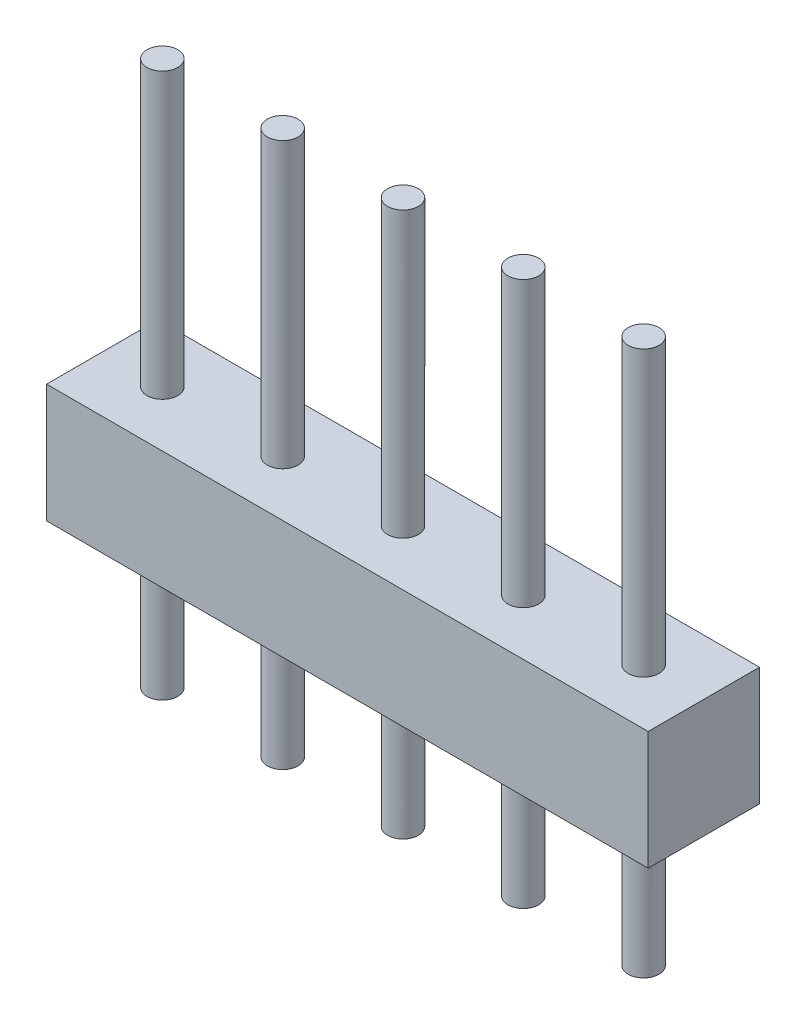
ISO-10303-21;
HEADER;
FILE_DESCRIPTION(('STEP AP214'),'2;1');
FILE_NAME('part.step','',(''),(''),'','','');
FILE_SCHEMA(('AUTOMOTIVE_DESIGN { 1 0 10303 214 1 1 1 1 }'));
ENDSEC;
DATA;
#1=APPLICATION_CONTEXT('core data for automotive mechanical design processes');
#2=APPLICATION_PROTOCOL_DEFINITION('international standard','automotive_design',2000,#1);
#3=PRODUCT_CONTEXT('',#1,'mechanical');
#4=PRODUCT('Part','Part','',(#3));
#5=PRODUCT_RELATED_PRODUCT_CATEGORY('part','',(#4));
#6=PRODUCT_DEFINITION_FORMATION('','',#4);
#7=PRODUCT_DEFINITION_CONTEXT('part definition',#1,'design');
#8=PRODUCT_DEFINITION('design','',#6,#7);
#9=PRODUCT_DEFINITION_SHAPE('','',#8);
#10=(LENGTH_UNIT() NAMED_UNIT(*) SI_UNIT(.MILLI.,.METRE.));
#11=(NAMED_UNIT(*) PLANE_ANGLE_UNIT() SI_UNIT($,.RADIAN.));
#12=(NAMED_UNIT(*) SI_UNIT($,.STERADIAN.) SOLID_ANGLE_UNIT());
#13=UNCERTAINTY_MEASURE_WITH_UNIT(LENGTH_MEASURE(1.E-05),#10,'distance_accuracy_value','');
#14=(GEOMETRIC_REPRESENTATION_CONTEXT(3) GLOBAL_UNCERTAINTY_ASSIGNED_CONTEXT((#13)) GLOBAL_UNIT_ASSIGNED_CONTEXT((#10,
#11,#12)) REPRESENTATION_CONTEXT('',''));
#15=CARTESIAN_POINT('',(0.,0.,0.));
#16=DIRECTION('',(0.,0.,1.));
#17=DIRECTION('',(1.,0.,0.));
#18=AXIS2_PLACEMENT_3D('',#15,#16,#17);
#19=CARTESIAN_POINT('',(0.,2.5,0.));
#20=DIRECTION('',(1.,0.,0.));
#21=DIRECTION('',(0.,0.,-1.));
#22=AXIS2_PLACEMENT_3D('',#19,#20,#21);
#23=PLANE('',#22);
#24=DIRECTION('',(0.,0.,1.));
#25=VECTOR('',#24,1.);
#26=CARTESIAN_POINT('',(0.,0.,0.));
#27=LINE('',#26,#25);
#28=CARTESIAN_POINT('',(0.,0.,-2.35));
#29=VERTEX_POINT('',#28);
#30=CARTESIAN_POINT('',(0.,0.,0.));
#31=VERTEX_POINT('',#30);
#32=EDGE_CURVE('E82',#29,#31,#27,.T.);
#33=ORIENTED_EDGE('',*,*,#32,.T.);
#34=DIRECTION('',(0.,-1.,0.));
#35=VECTOR('',#34,1.);
#36=CARTESIAN_POINT('',(0.,2.5,0.));
#37=LINE('',#36,#35);
#38=CARTESIAN_POINT('',(0.,2.5,0.));
#39=VERTEX_POINT('',#38);
#40=EDGE_CURVE('E119',#39,#31,#37,.T.);
#41=ORIENTED_EDGE('',*,*,#40,.F.);
#42=DIRECTION('',(0.,0.,1.));
#43=VECTOR('',#42,1.);
#44=CARTESIAN_POINT('',(0.,2.5,0.));
#45=LINE('',#44,#43);
#46=CARTESIAN_POINT('',(0.,2.5,-2.35));
#47=VERTEX_POINT('',#46);
#48=EDGE_CURVE('E84',#47,#39,#45,.T.);
#49=ORIENTED_EDGE('',*,*,#48,.F.);
#50=DIRECTION('',(0.,-1.,0.));
#51=VECTOR('',#50,1.);
#52=CARTESIAN_POINT('',(0.,2.5,-2.35));
#53=LINE('',#52,#51);
#54=EDGE_CURVE('E115',#47,#29,#53,.T.);
#55=ORIENTED_EDGE('',*,*,#54,.T.);
#56=EDGE_LOOP('',(#33,#41,#49,#55));
#57=FACE_BOUND('',#56,.T.);
#58=ADVANCED_FACE('F36',(#57),#23,.F.);
#59=CARTESIAN_POINT('',(0.,2.5,0.));
#60=DIRECTION('',(0.,0.,-1.));
#61=DIRECTION('',(-1.,0.,0.));
#62=AXIS2_PLACEMENT_3D('',#59,#60,#61);
#63=PLANE('',#62);
#64=DIRECTION('',(1.,0.,0.));
#65=VECTOR('',#64,1.);
#66=CARTESIAN_POINT('',(0.,0.,0.));
#67=LINE('',#66,#65);
#68=CARTESIAN_POINT('',(12.7,0.,0.));
#69=VERTEX_POINT('',#68);
#70=EDGE_CURVE('E64',#31,#69,#67,.T.);
#71=ORIENTED_EDGE('',*,*,#70,.T.);
#72=DIRECTION('',(0.,-1.,0.));
#73=VECTOR('',#72,1.);
#74=CARTESIAN_POINT('',(12.7,2.5,0.));
#75=LINE('',#74,#73);
#76=CARTESIAN_POINT('',(12.7,2.5,0.));
#77=VERTEX_POINT('',#76);
#78=EDGE_CURVE('E93',#77,#69,#75,.T.);
#79=ORIENTED_EDGE('',*,*,#78,.F.);
#80=DIRECTION('',(1.,0.,0.));
#81=VECTOR('',#80,1.);
#82=CARTESIAN_POINT('',(0.,2.5,0.));
#83=LINE('',#82,#81);
#84=EDGE_CURVE('E112',#39,#77,#83,.T.);
#85=ORIENTED_EDGE('',*,*,#84,.F.);
#86=ORIENTED_EDGE('',*,*,#40,.T.);
#87=EDGE_LOOP('',(#71,#79,#85,#86));
#88=FACE_BOUND('',#87,.T.);
#89=ADVANCED_FACE('F160',(#88),#63,.F.);
#90=CARTESIAN_POINT('',(0.,2.5,-2.35));
#91=DIRECTION('',(0.,0.,1.));
#92=DIRECTION('',(1.,0.,0.));
#93=AXIS2_PLACEMENT_3D('',#90,#91,#92);
#94=PLANE('',#93);
#95=DIRECTION('',(-1.,0.,0.));
#96=VECTOR('',#95,1.);
#97=CARTESIAN_POINT('',(0.,0.,-2.35));
#98=LINE('',#97,#96);
#99=CARTESIAN_POINT('',(12.7,0.,-2.35));
#100=VERTEX_POINT('',#99);
#101=EDGE_CURVE('E77',#100,#29,#98,.T.);
#102=ORIENTED_EDGE('',*,*,#101,.T.);
#103=ORIENTED_EDGE('',*,*,#54,.F.);
#104=DIRECTION('',(-1.,0.,0.));
#105=VECTOR('',#104,1.);
#106=CARTESIAN_POINT('',(0.,2.5,-2.35));
#107=LINE('',#106,#105);
#108=CARTESIAN_POINT('',(12.7,2.5,-2.35));
#109=VERTEX_POINT('',#108);
#110=EDGE_CURVE('E52',#109,#47,#107,.T.);
#111=ORIENTED_EDGE('',*,*,#110,.F.);
#112=DIRECTION('',(0.,-1.,0.));
#113=VECTOR('',#112,1.);
#114=CARTESIAN_POINT('',(12.7,2.5,-2.35));
#115=LINE('',#114,#113);
#116=EDGE_CURVE('E91',#109,#100,#115,.T.);
#117=ORIENTED_EDGE('',*,*,#116,.T.);
#118=EDGE_LOOP('',(#102,#103,#111,#117));
#119=FACE_BOUND('',#118,.T.);
#120=ADVANCED_FACE('F97',(#119),#94,.F.);
#121=CARTESIAN_POINT('',(0.,2.5,0.));
#122=DIRECTION('',(0.,-1.,0.));
#123=DIRECTION('',(0.,0.,-1.));
#124=AXIS2_PLACEMENT_3D('',#121,#122,#123);
#125=PLANE('',#124);
#126=CARTESIAN_POINT('',(11.43,2.5,-1.175));
#127=DIRECTION('',(0.,-1.,0.));
#128=DIRECTION('',(0.,0.,-1.));
#129=AXIS2_PLACEMENT_3D('',#126,#127,#128);
#130=CIRCLE('',#129,0.325);
#131=CARTESIAN_POINT('',(11.43,2.5,-1.5));
#132=VERTEX_POINT('',#131);
#133=EDGE_CURVE('E178',#132,#132,#130,.T.);
#134=ORIENTED_EDGE('',*,*,#133,.T.);
#135=EDGE_LOOP('',(#134));
#136=FACE_BOUND('',#135,.T.);
#137=CARTESIAN_POINT('',(8.89,2.5,-1.175));
#138=DIRECTION('',(0.,-1.,0.));
#139=DIRECTION('',(0.,0.,-1.));
#140=AXIS2_PLACEMENT_3D('',#137,#138,#139);
#141=CIRCLE('',#140,0.325);
#142=CARTESIAN_POINT('',(8.89,2.5,-1.5));
#143=VERTEX_POINT('',#142);
#144=EDGE_CURVE('E182',#143,#143,#141,.T.);
#145=ORIENTED_EDGE('',*,*,#144,.T.);
#146=EDGE_LOOP('',(#145));
#147=FACE_BOUND('',#146,.T.);
#148=CARTESIAN_POINT('',(6.35,2.5,-1.175));
#149=DIRECTION('',(0.,-1.,0.));
#150=DIRECTION('',(0.,0.,-1.));
#151=AXIS2_PLACEMENT_3D('',#148,#149,#150);
#152=CIRCLE('',#151,0.325);
#153=CARTESIAN_POINT('',(6.35,2.5,-1.5));
#154=VERTEX_POINT('',#153);
#155=EDGE_CURVE('E186',#154,#154,#152,.T.);
#156=ORIENTED_EDGE('',*,*,#155,.T.);
#157=EDGE_LOOP('',(#156));
#158=FACE_BOUND('',#157,.T.);
#159=CARTESIAN_POINT('',(3.81,2.5,-1.175));
#160=DIRECTION('',(0.,-1.,0.));
#161=DIRECTION('',(0.,0.,-1.));
#162=AXIS2_PLACEMENT_3D('',#159,#160,#161);
#163=CIRCLE('',#162,0.325);
#164=CARTESIAN_POINT('',(3.81,2.5,-1.5));
#165=VERTEX_POINT('',#164);
#166=EDGE_CURVE('E95',#165,#165,#163,.T.);
#167=ORIENTED_EDGE('',*,*,#166,.T.);
#168=EDGE_LOOP('',(#167));
#169=FACE_BOUND('',#168,.T.);
#170=CARTESIAN_POINT('',(1.27,2.5,-1.175));
#171=DIRECTION('',(0.,-1.,0.));
#172=DIRECTION('',(0.,0.,-1.));
#173=AXIS2_PLACEMENT_3D('',#170,#171,#172);
#174=CIRCLE('',#173,0.325);
#175=CARTESIAN_POINT('',(1.27,2.5,-1.5));
#176=VERTEX_POINT('',#175);
#177=EDGE_CURVE('E108',#176,#176,#174,.T.);
#178=ORIENTED_EDGE('',*,*,#177,.T.);
#179=EDGE_LOOP('',(#178));
#180=FACE_BOUND('',#179,.T.);
#181=ORIENTED_EDGE('',*,*,#48,.T.);
#182=ORIENTED_EDGE('',*,*,#84,.T.);
#183=DIRECTION('',(0.,0.,-1.));
#184=VECTOR('',#183,1.);
#185=CARTESIAN_POINT('',(12.7,2.5,0.));
#186=LINE('',#185,#184);
#187=EDGE_CURVE('E94',#77,#109,#186,.T.);
#188=ORIENTED_EDGE('',*,*,#187,.T.);
#189=ORIENTED_EDGE('',*,*,#110,.T.);
#190=EDGE_LOOP('',(#181,#182,#188,#189));
#191=FACE_BOUND('',#190,.T.);
#192=ADVANCED_FACE('F138',(#136,#147,#158,#169,#180,#191),#125,.F.);
#193=CARTESIAN_POINT('',(0.,0.,0.));
#194=DIRECTION('',(0.,-1.,0.));
#195=DIRECTION('',(0.,0.,-1.));
#196=AXIS2_PLACEMENT_3D('',#193,#194,#195);
#197=PLANE('',#196);
#198=CARTESIAN_POINT('',(11.43,0.,-1.175));
#199=DIRECTION('',(0.,-1.,0.));
#200=DIRECTION('',(0.,0.,-1.));
#201=AXIS2_PLACEMENT_3D('',#198,#199,#200);
#202=CIRCLE('',#201,0.325);
#203=CARTESIAN_POINT('',(11.43,0.,-1.5));
#204=VERTEX_POINT('',#203);
#205=EDGE_CURVE('E11',#204,#204,#202,.T.);
#206=ORIENTED_EDGE('',*,*,#205,.F.);
#207=EDGE_LOOP('',(#206));
#208=FACE_BOUND('',#207,.T.);
#209=CARTESIAN_POINT('',(8.89,0.,-1.175));
#210=DIRECTION('',(0.,-1.,0.));
#211=DIRECTION('',(0.,0.,-1.));
#212=AXIS2_PLACEMENT_3D('',#209,#210,#211);
#213=CIRCLE('',#212,0.325);
#214=CARTESIAN_POINT('',(8.89,0.,-1.5));
#215=VERTEX_POINT('',#214);
#216=EDGE_CURVE('E44',#215,#215,#213,.T.);
#217=ORIENTED_EDGE('',*,*,#216,.F.);
#218=EDGE_LOOP('',(#217));
#219=FACE_BOUND('',#218,.T.);
#220=CARTESIAN_POINT('',(6.35,0.,-1.175));
#221=DIRECTION('',(0.,-1.,0.));
#222=DIRECTION('',(0.,0.,-1.));
#223=AXIS2_PLACEMENT_3D('',#220,#221,#222);
#224=CIRCLE('',#223,0.325);
#225=CARTESIAN_POINT('',(6.35,0.,-1.5));
#226=VERTEX_POINT('',#225);
#227=EDGE_CURVE('E127',#226,#226,#224,.T.);
#228=ORIENTED_EDGE('',*,*,#227,.F.);
#229=EDGE_LOOP('',(#228));
#230=FACE_BOUND('',#229,.T.);
#231=CARTESIAN_POINT('',(3.81,0.,-1.175));
#232=DIRECTION('',(0.,-1.,0.));
#233=DIRECTION('',(0.,0.,-1.));
#234=AXIS2_PLACEMENT_3D('',#231,#232,#233);
#235=CIRCLE('',#234,0.325);
#236=CARTESIAN_POINT('',(3.81,0.,-1.5));
#237=VERTEX_POINT('',#236);
#238=EDGE_CURVE('E124',#237,#237,#235,.T.);
#239=ORIENTED_EDGE('',*,*,#238,.F.);
#240=EDGE_LOOP('',(#239));
#241=FACE_BOUND('',#240,.T.);
#242=CARTESIAN_POINT('',(1.27,0.,-1.175));
#243=DIRECTION('',(0.,-1.,0.));
#244=DIRECTION('',(0.,0.,-1.));
#245=AXIS2_PLACEMENT_3D('',#242,#243,#244);
#246=CIRCLE('',#245,0.325);
#247=CARTESIAN_POINT('',(1.27,0.,-1.5));
#248=VERTEX_POINT('',#247);
#249=EDGE_CURVE('E121',#248,#248,#246,.T.);
#250=ORIENTED_EDGE('',*,*,#249,.F.);
#251=EDGE_LOOP('',(#250));
#252=FACE_BOUND('',#251,.T.);
#253=ORIENTED_EDGE('',*,*,#32,.F.);
#254=ORIENTED_EDGE('',*,*,#101,.F.);
#255=DIRECTION('',(0.,0.,-1.));
#256=VECTOR('',#255,1.);
#257=CARTESIAN_POINT('',(12.7,0.,0.));
#258=LINE('',#257,#256);
#259=EDGE_CURVE('E80',#69,#100,#258,.T.);
#260=ORIENTED_EDGE('',*,*,#259,.F.);
#261=ORIENTED_EDGE('',*,*,#70,.F.);
#262=EDGE_LOOP('',(#253,#254,#260,#261));
#263=FACE_BOUND('',#262,.T.);
#264=ADVANCED_FACE('F79',(#208,#219,#230,#241,#252,#263),#197,.T.);
#265=CARTESIAN_POINT('',(1.27,-3.,-1.175));
#266=DIRECTION('',(0.,1.,0.));
#267=DIRECTION('',(0.,0.,1.));
#268=AXIS2_PLACEMENT_3D('',#265,#266,#267);
#269=PLANE('',#268);
#270=CARTESIAN_POINT('',(1.27,-3.,-1.175));
#271=DIRECTION('',(0.,1.,0.));
#272=DIRECTION('',(0.,0.,1.));
#273=AXIS2_PLACEMENT_3D('',#270,#271,#272);
#274=CIRCLE('',#273,0.325);
#275=CARTESIAN_POINT('',(1.27,-3.,-0.85));
#276=VERTEX_POINT('',#275);
#277=EDGE_CURVE('E105',#276,#276,#274,.T.);
#278=ORIENTED_EDGE('',*,*,#277,.F.);
#279=EDGE_LOOP('',(#278));
#280=FACE_BOUND('',#279,.T.);
#281=ADVANCED_FACE('F137',(#280),#269,.F.);
#282=CARTESIAN_POINT('',(1.27,-3.,-1.175));
#283=DIRECTION('',(0.,1.,0.));
#284=DIRECTION('',(0.,0.,1.));
#285=AXIS2_PLACEMENT_3D('',#282,#283,#284);
#286=CYLINDRICAL_SURFACE('',#285,0.325);
#287=ORIENTED_EDGE('',*,*,#249,.T.);
#288=EDGE_LOOP('',(#287));
#289=FACE_BOUND('',#288,.T.);
#290=ORIENTED_EDGE('',*,*,#277,.T.);
#291=EDGE_LOOP('',(#290));
#292=FACE_BOUND('',#291,.T.);
#293=ADVANCED_FACE('F147',(#289,#292),#286,.T.);
#294=CARTESIAN_POINT('',(1.27,8.5,-1.175));
#295=DIRECTION('',(0.,1.,0.));
#296=DIRECTION('',(0.,0.,1.));
#297=AXIS2_PLACEMENT_3D('',#294,#295,#296);
#298=CIRCLE('',#297,0.325);
#299=CARTESIAN_POINT('',(1.27,8.5,-0.85));
#300=VERTEX_POINT('',#299);
#301=EDGE_CURVE('E99',#300,#300,#298,.T.);
#302=ORIENTED_EDGE('',*,*,#301,.F.);
#303=EDGE_LOOP('',(#302));
#304=FACE_BOUND('',#303,.T.);
#305=ORIENTED_EDGE('',*,*,#177,.F.);
#306=EDGE_LOOP('',(#305));
#307=FACE_BOUND('',#306,.T.);
#308=ADVANCED_FACE('F150',(#304,#307),#286,.T.);
#309=CARTESIAN_POINT('',(1.27,8.5,-1.175));
#310=DIRECTION('',(0.,1.,0.));
#311=DIRECTION('',(0.,0.,1.));
#312=AXIS2_PLACEMENT_3D('',#309,#310,#311);
#313=PLANE('',#312);
#314=ORIENTED_EDGE('',*,*,#301,.T.);
#315=EDGE_LOOP('',(#314));
#316=FACE_BOUND('',#315,.T.);
#317=ADVANCED_FACE('F193',(#316),#313,.T.);
#318=CARTESIAN_POINT('',(12.7,2.5,0.));
#319=DIRECTION('',(-1.,0.,0.));
#320=DIRECTION('',(0.,0.,1.));
#321=AXIS2_PLACEMENT_3D('',#318,#319,#320);
#322=PLANE('',#321);
#323=ORIENTED_EDGE('',*,*,#259,.T.);
#324=ORIENTED_EDGE('',*,*,#116,.F.);
#325=ORIENTED_EDGE('',*,*,#187,.F.);
#326=ORIENTED_EDGE('',*,*,#78,.T.);
#327=EDGE_LOOP('',(#323,#324,#325,#326));
#328=FACE_BOUND('',#327,.T.);
#329=ADVANCED_FACE('F89',(#328),#322,.F.);
#330=CARTESIAN_POINT('',(3.81,-3.,-1.175));
#331=DIRECTION('',(0.,1.,0.));
#332=DIRECTION('',(0.,0.,1.));
#333=AXIS2_PLACEMENT_3D('',#330,#331,#332);
#334=PLANE('',#333);
#335=CARTESIAN_POINT('',(3.81,-3.,-1.175));
#336=DIRECTION('',(0.,1.,0.));
#337=DIRECTION('',(0.,0.,1.));
#338=AXIS2_PLACEMENT_3D('',#335,#336,#337);
#339=CIRCLE('',#338,0.325);
#340=CARTESIAN_POINT('',(3.81,-3.,-0.85));
#341=VERTEX_POINT('',#340);
#342=EDGE_CURVE('E284',#341,#341,#339,.T.);
#343=ORIENTED_EDGE('',*,*,#342,.F.);
#344=EDGE_LOOP('',(#343));
#345=FACE_BOUND('',#344,.T.);
#346=ADVANCED_FACE('F203',(#345),#334,.F.);
#347=CARTESIAN_POINT('',(3.81,-3.,-1.175));
#348=DIRECTION('',(0.,1.,0.));
#349=DIRECTION('',(0.,0.,1.));
#350=AXIS2_PLACEMENT_3D('',#347,#348,#349);
#351=CYLINDRICAL_SURFACE('',#350,0.325);
#352=ORIENTED_EDGE('',*,*,#238,.T.);
#353=EDGE_LOOP('',(#352));
#354=FACE_BOUND('',#353,.T.);
#355=ORIENTED_EDGE('',*,*,#342,.T.);
#356=EDGE_LOOP('',(#355));
#357=FACE_BOUND('',#356,.T.);
#358=ADVANCED_FACE('F206',(#354,#357),#351,.T.);
#359=CARTESIAN_POINT('',(3.81,8.5,-1.175));
#360=DIRECTION('',(0.,1.,0.));
#361=DIRECTION('',(0.,0.,1.));
#362=AXIS2_PLACEMENT_3D('',#359,#360,#361);
#363=CIRCLE('',#362,0.325);
#364=CARTESIAN_POINT('',(3.81,8.5,-0.85));
#365=VERTEX_POINT('',#364);
#366=EDGE_CURVE('E281',#365,#365,#363,.T.);
#367=ORIENTED_EDGE('',*,*,#366,.F.);
#368=EDGE_LOOP('',(#367));
#369=FACE_BOUND('',#368,.T.);
#370=ORIENTED_EDGE('',*,*,#166,.F.);
#371=EDGE_LOOP('',(#370));
#372=FACE_BOUND('',#371,.T.);
#373=ADVANCED_FACE('F209',(#369,#372),#351,.T.);
#374=CARTESIAN_POINT('',(3.81,8.5,-1.175));
#375=DIRECTION('',(0.,1.,0.));
#376=DIRECTION('',(0.,0.,1.));
#377=AXIS2_PLACEMENT_3D('',#374,#375,#376);
#378=PLANE('',#377);
#379=ORIENTED_EDGE('',*,*,#366,.T.);
#380=EDGE_LOOP('',(#379));
#381=FACE_BOUND('',#380,.T.);
#382=ADVANCED_FACE('F214',(#381),#378,.T.);
#383=CARTESIAN_POINT('',(6.35,-3.,-1.175));
#384=DIRECTION('',(0.,1.,0.));
#385=DIRECTION('',(0.,0.,1.));
#386=AXIS2_PLACEMENT_3D('',#383,#384,#385);
#387=PLANE('',#386);
#388=CARTESIAN_POINT('',(6.35,-3.,-1.175));
#389=DIRECTION('',(0.,1.,0.));
#390=DIRECTION('',(0.,0.,1.));
#391=AXIS2_PLACEMENT_3D('',#388,#389,#390);
#392=CIRCLE('',#391,0.325);
#393=CARTESIAN_POINT('',(6.35,-3.,-0.85));
#394=VERTEX_POINT('',#393);
#395=EDGE_CURVE('E277',#394,#394,#392,.T.);
#396=ORIENTED_EDGE('',*,*,#395,.F.);
#397=EDGE_LOOP('',(#396));
#398=FACE_BOUND('',#397,.T.);
#399=ADVANCED_FACE('F217',(#398),#387,.F.);
#400=CARTESIAN_POINT('',(6.35,-3.,-1.175));
#401=DIRECTION('',(0.,1.,0.));
#402=DIRECTION('',(0.,0.,1.));
#403=AXIS2_PLACEMENT_3D('',#400,#401,#402);
#404=CYLINDRICAL_SURFACE('',#403,0.325);
#405=ORIENTED_EDGE('',*,*,#227,.T.);
#406=EDGE_LOOP('',(#405));
#407=FACE_BOUND('',#406,.T.);
#408=ORIENTED_EDGE('',*,*,#395,.T.);
#409=EDGE_LOOP('',(#408));
#410=FACE_BOUND('',#409,.T.);
#411=ADVANCED_FACE('F219',(#407,#410),#404,.T.);
#412=CARTESIAN_POINT('',(6.35,8.5,-1.175));
#413=DIRECTION('',(0.,1.,0.));
#414=DIRECTION('',(0.,0.,1.));
#415=AXIS2_PLACEMENT_3D('',#412,#413,#414);
#416=CIRCLE('',#415,0.325);
#417=CARTESIAN_POINT('',(6.35,8.5,-0.85));
#418=VERTEX_POINT('',#417);
#419=EDGE_CURVE('E274',#418,#418,#416,.T.);
#420=ORIENTED_EDGE('',*,*,#419,.F.);
#421=EDGE_LOOP('',(#420));
#422=FACE_BOUND('',#421,.T.);
#423=ORIENTED_EDGE('',*,*,#155,.F.);
#424=EDGE_LOOP('',(#423));
#425=FACE_BOUND('',#424,.T.);
#426=ADVANCED_FACE('F222',(#422,#425),#404,.T.);
#427=CARTESIAN_POINT('',(6.35,8.5,-1.175));
#428=DIRECTION('',(0.,1.,0.));
#429=DIRECTION('',(0.,0.,1.));
#430=AXIS2_PLACEMENT_3D('',#427,#428,#429);
#431=PLANE('',#430);
#432=ORIENTED_EDGE('',*,*,#419,.T.);
#433=EDGE_LOOP('',(#432));
#434=FACE_BOUND('',#433,.T.);
#435=ADVANCED_FACE('F227',(#434),#431,.T.);
#436=CARTESIAN_POINT('',(8.89,-3.,-1.175));
#437=DIRECTION('',(0.,1.,0.));
#438=DIRECTION('',(0.,0.,1.));
#439=AXIS2_PLACEMENT_3D('',#436,#437,#438);
#440=PLANE('',#439);
#441=CARTESIAN_POINT('',(8.89,-3.,-1.175));
#442=DIRECTION('',(0.,1.,0.));
#443=DIRECTION('',(0.,0.,1.));
#444=AXIS2_PLACEMENT_3D('',#441,#442,#443);
#445=CIRCLE('',#444,0.325);
#446=CARTESIAN_POINT('',(8.89,-3.,-0.85));
#447=VERTEX_POINT('',#446);
#448=EDGE_CURVE('E270',#447,#447,#445,.T.);
#449=ORIENTED_EDGE('',*,*,#448,.F.);
#450=EDGE_LOOP('',(#449));
#451=FACE_BOUND('',#450,.T.);
#452=ADVANCED_FACE('F230',(#451),#440,.F.);
#453=CARTESIAN_POINT('',(8.89,-3.,-1.175));
#454=DIRECTION('',(0.,1.,0.));
#455=DIRECTION('',(0.,0.,1.));
#456=AXIS2_PLACEMENT_3D('',#453,#454,#455);
#457=CYLINDRICAL_SURFACE('',#456,0.325);
#458=ORIENTED_EDGE('',*,*,#216,.T.);
#459=EDGE_LOOP('',(#458));
#460=FACE_BOUND('',#459,.T.);
#461=ORIENTED_EDGE('',*,*,#448,.T.);
#462=EDGE_LOOP('',(#461));
#463=FACE_BOUND('',#462,.T.);
#464=ADVANCED_FACE('F132',(#460,#463),#457,.T.);
#465=CARTESIAN_POINT('',(8.89,8.5,-1.175));
#466=DIRECTION('',(0.,1.,0.));
#467=DIRECTION('',(0.,0.,1.));
#468=AXIS2_PLACEMENT_3D('',#465,#466,#467);
#469=CIRCLE('',#468,0.325);
#470=CARTESIAN_POINT('',(8.89,8.5,-0.85));
#471=VERTEX_POINT('',#470);
#472=EDGE_CURVE('E267',#471,#471,#469,.T.);
#473=ORIENTED_EDGE('',*,*,#472,.F.);
#474=EDGE_LOOP('',(#473));
#475=FACE_BOUND('',#474,.T.);
#476=ORIENTED_EDGE('',*,*,#144,.F.);
#477=EDGE_LOOP('',(#476));
#478=FACE_BOUND('',#477,.T.);
#479=ADVANCED_FACE('F234',(#475,#478),#457,.T.);
#480=CARTESIAN_POINT('',(8.89,8.5,-1.175));
#481=DIRECTION('',(0.,1.,0.));
#482=DIRECTION('',(0.,0.,1.));
#483=AXIS2_PLACEMENT_3D('',#480,#481,#482);
#484=PLANE('',#483);
#485=ORIENTED_EDGE('',*,*,#472,.T.);
#486=EDGE_LOOP('',(#485));
#487=FACE_BOUND('',#486,.T.);
#488=ADVANCED_FACE('F238',(#487),#484,.T.);
#489=CARTESIAN_POINT('',(11.43,-3.,-1.175));
#490=DIRECTION('',(0.,1.,0.));
#491=DIRECTION('',(0.,0.,1.));
#492=AXIS2_PLACEMENT_3D('',#489,#490,#491);
#493=PLANE('',#492);
#494=CARTESIAN_POINT('',(11.43,-3.,-1.175));
#495=DIRECTION('',(0.,1.,0.));
#496=DIRECTION('',(0.,0.,1.));
#497=AXIS2_PLACEMENT_3D('',#494,#495,#496);
#498=CIRCLE('',#497,0.325);
#499=CARTESIAN_POINT('',(11.43,-3.,-0.85));
#500=VERTEX_POINT('',#499);
#501=EDGE_CURVE('E261',#500,#500,#498,.T.);
#502=ORIENTED_EDGE('',*,*,#501,.F.);
#503=EDGE_LOOP('',(#502));
#504=FACE_BOUND('',#503,.T.);
#505=ADVANCED_FACE('F241',(#504),#493,.F.);
#506=CARTESIAN_POINT('',(11.43,-3.,-1.175));
#507=DIRECTION('',(0.,1.,0.));
#508=DIRECTION('',(0.,0.,1.));
#509=AXIS2_PLACEMENT_3D('',#506,#507,#508);
#510=CYLINDRICAL_SURFACE('',#509,0.325);
#511=ORIENTED_EDGE('',*,*,#205,.T.);
#512=EDGE_LOOP('',(#511));
#513=FACE_BOUND('',#512,.T.);
#514=ORIENTED_EDGE('',*,*,#501,.T.);
#515=EDGE_LOOP('',(#514));
#516=FACE_BOUND('',#515,.T.);
#517=ADVANCED_FACE('F243',(#513,#516),#510,.T.);
#518=CARTESIAN_POINT('',(11.43,8.5,-1.175));
#519=DIRECTION('',(0.,1.,0.));
#520=DIRECTION('',(0.,0.,1.));
#521=AXIS2_PLACEMENT_3D('',#518,#519,#520);
#522=CIRCLE('',#521,0.325);
#523=CARTESIAN_POINT('',(11.43,8.5,-0.85));
#524=VERTEX_POINT('',#523);
#525=EDGE_CURVE('E260',#524,#524,#522,.T.);
#526=ORIENTED_EDGE('',*,*,#525,.F.);
#527=EDGE_LOOP('',(#526));
#528=FACE_BOUND('',#527,.T.);
#529=ORIENTED_EDGE('',*,*,#133,.F.);
#530=EDGE_LOOP('',(#529));
#531=FACE_BOUND('',#530,.T.);
#532=ADVANCED_FACE('F246',(#528,#531),#510,.T.);
#533=CARTESIAN_POINT('',(11.43,8.5,-1.175));
#534=DIRECTION('',(0.,1.,0.));
#535=DIRECTION('',(0.,0.,1.));
#536=AXIS2_PLACEMENT_3D('',#533,#534,#535);
#537=PLANE('',#536);
#538=ORIENTED_EDGE('',*,*,#525,.T.);
#539=EDGE_LOOP('',(#538));
#540=FACE_BOUND('',#539,.T.);
#541=ADVANCED_FACE('F251',(#540),#537,.T.);
#542=CLOSED_SHELL('',(#58,#89,#120,#192,#264,#281,#293,#308,#317,#329,#346,#358,#373,#382,#399,
#411,#426,#435,#452,#464,#479,#488,#505,#517,#532,#541));
#543=MANIFOLD_SOLID_BREP('B2',#542);
#544=ADVANCED_BREP_SHAPE_REPRESENTATION('',(#18,#543),#14);
#545=SHAPE_DEFINITION_REPRESENTATION(#9,#544);
ENDSEC;
END-ISO-10303-21;
